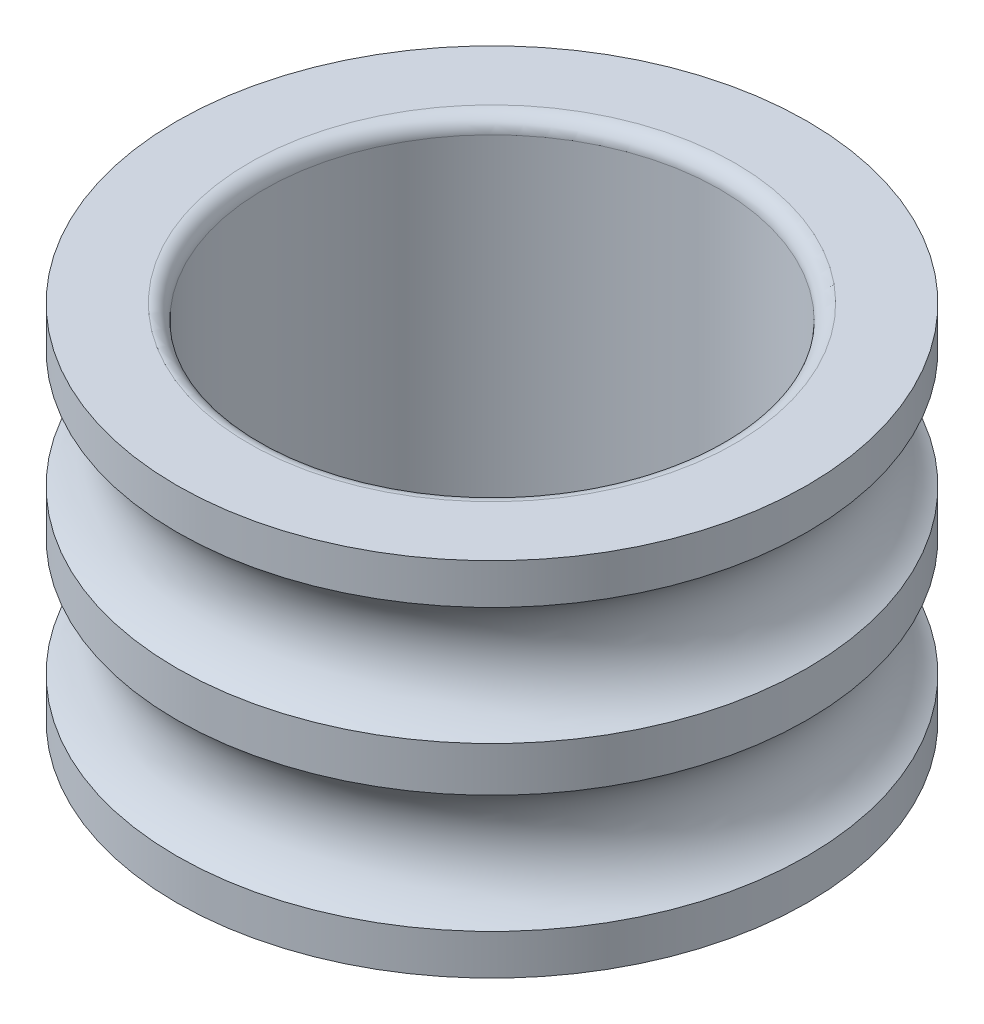
ISO-10303-21;
HEADER;
FILE_DESCRIPTION(('STEP AP214'),'2;1');
FILE_NAME('part.step','',(''),(''),'','','');
FILE_SCHEMA(('AUTOMOTIVE_DESIGN { 1 0 10303 214 1 1 1 1 }'));
ENDSEC;
DATA;
#1=APPLICATION_CONTEXT('core data for automotive mechanical design processes');
#2=APPLICATION_PROTOCOL_DEFINITION('international standard','automotive_design',2000,#1);
#3=PRODUCT_CONTEXT('',#1,'mechanical');
#4=PRODUCT('Part','Part','',(#3));
#5=PRODUCT_RELATED_PRODUCT_CATEGORY('part','',(#4));
#6=PRODUCT_DEFINITION_FORMATION('','',#4);
#7=PRODUCT_DEFINITION_CONTEXT('part definition',#1,'design');
#8=PRODUCT_DEFINITION('design','',#6,#7);
#9=PRODUCT_DEFINITION_SHAPE('','',#8);
#10=(LENGTH_UNIT() NAMED_UNIT(*) SI_UNIT(.MILLI.,.METRE.));
#11=(NAMED_UNIT(*) PLANE_ANGLE_UNIT() SI_UNIT($,.RADIAN.));
#12=(NAMED_UNIT(*) SI_UNIT($,.STERADIAN.) SOLID_ANGLE_UNIT());
#13=UNCERTAINTY_MEASURE_WITH_UNIT(LENGTH_MEASURE(1.E-05),#10,'distance_accuracy_value','');
#14=(GEOMETRIC_REPRESENTATION_CONTEXT(3) GLOBAL_UNCERTAINTY_ASSIGNED_CONTEXT((#13)) GLOBAL_UNIT_ASSIGNED_CONTEXT((#10,
#11,#12)) REPRESENTATION_CONTEXT('',''));
#15=CARTESIAN_POINT('',(0.,0.,0.));
#16=DIRECTION('',(0.,0.,1.));
#17=DIRECTION('',(1.,0.,0.));
#18=AXIS2_PLACEMENT_3D('',#15,#16,#17);
#19=CARTESIAN_POINT('',(0.,-23.8,18.38));
#20=DIRECTION('',(0.,-1.,0.));
#21=DIRECTION('',(-1.,0.,0.));
#22=AXIS2_PLACEMENT_3D('',#19,#20,#21);
#23=PLANE('',#22);
#24=CARTESIAN_POINT('',(0.,-23.8,0.));
#25=DIRECTION('',(0.,1.,0.));
#26=DIRECTION('',(0.,0.,1.));
#27=AXIS2_PLACEMENT_3D('',#24,#25,#26);
#28=CIRCLE('',#27,20.76);
#29=CARTESIAN_POINT('',(0.,-23.8,-20.76));
#30=VERTEX_POINT('',#29);
#31=EDGE_CURVE('E27',#30,#30,#28,.T.);
#32=ORIENTED_EDGE('',*,*,#31,.F.);
#33=EDGE_LOOP('',(#32));
#34=FACE_BOUND('',#33,.T.);
#35=CARTESIAN_POINT('',(0.,-23.8,0.));
#36=DIRECTION('',(0.,1.,0.));
#37=DIRECTION('',(0.,0.,1.));
#38=AXIS2_PLACEMENT_3D('',#35,#36,#37);
#39=CIRCLE('',#38,16.);
#40=CARTESIAN_POINT('',(0.,-23.8,-16.));
#41=VERTEX_POINT('',#40);
#42=EDGE_CURVE('E11',#41,#41,#39,.T.);
#43=ORIENTED_EDGE('',*,*,#42,.T.);
#44=EDGE_LOOP('',(#43));
#45=FACE_BOUND('',#44,.T.);
#46=ADVANCED_FACE('F16',(#34,#45),#23,.T.);
#47=CARTESIAN_POINT('',(0.,-22.4673969044771,0.));
#48=DIRECTION('',(0.,1.,0.));
#49=DIRECTION('',(0.,0.,1.));
#50=AXIS2_PLACEMENT_3D('',#47,#48,#49);
#51=CYLINDRICAL_SURFACE('',#50,20.76);
#52=ORIENTED_EDGE('',*,*,#31,.T.);
#53=EDGE_LOOP('',(#52));
#54=FACE_BOUND('',#53,.T.);
#55=CARTESIAN_POINT('',(0.,-21.1347938089543,0.));
#56=DIRECTION('',(0.,1.,0.));
#57=DIRECTION('',(0.,0.,1.));
#58=AXIS2_PLACEMENT_3D('',#55,#56,#57);
#59=CIRCLE('',#58,20.76);
#60=CARTESIAN_POINT('',(4.61953458893309,-21.1347938089543,20.2395034568947));
#61=VERTEX_POINT('',#60);
#62=EDGE_CURVE('E85',#61,#61,#59,.T.);
#63=ORIENTED_EDGE('',*,*,#62,.F.);
#64=EDGE_LOOP('',(#63));
#65=FACE_BOUND('',#64,.T.);
#66=ADVANCED_FACE('F111',(#54,#65),#51,.T.);
#67=CARTESIAN_POINT('',(0.,-22.8,0.));
#68=DIRECTION('',(0.,1.,0.));
#69=DIRECTION('',(0.,0.,1.));
#70=AXIS2_PLACEMENT_3D('',#67,#68,#69);
#71=TOROIDAL_SURFACE('',#70,16.,1.);
#72=CARTESIAN_POINT('',(0.,-22.8,0.));
#73=DIRECTION('',(0.,1.,0.));
#74=DIRECTION('',(0.,0.,1.));
#75=AXIS2_PLACEMENT_3D('',#72,#73,#74);
#76=CIRCLE('',#75,15.);
#77=CARTESIAN_POINT('',(0.,-22.8,-15.));
#78=VERTEX_POINT('',#77);
#79=EDGE_CURVE('E94',#78,#78,#76,.T.);
#80=ORIENTED_EDGE('',*,*,#79,.T.);
#81=EDGE_LOOP('',(#80));
#82=FACE_BOUND('',#81,.T.);
#83=ORIENTED_EDGE('',*,*,#42,.F.);
#84=EDGE_LOOP('',(#83));
#85=FACE_BOUND('',#84,.T.);
#86=ADVANCED_FACE('F113',(#82,#85),#71,.T.);
#87=CARTESIAN_POINT('',(0.,-17.255,0.));
#88=DIRECTION('',(0.,1.,0.));
#89=DIRECTION('',(0.,0.,1.));
#90=AXIS2_PLACEMENT_3D('',#87,#88,#89);
#91=TOROIDAL_SURFACE('',#90,23.,4.48);
#92=ORIENTED_EDGE('',*,*,#62,.T.);
#93=EDGE_LOOP('',(#92));
#94=FACE_BOUND('',#93,.T.);
#95=CARTESIAN_POINT('',(0.,-13.3752061910457,0.));
#96=DIRECTION('',(0.,1.,0.));
#97=DIRECTION('',(0.,0.,1.));
#98=AXIS2_PLACEMENT_3D('',#95,#96,#97);
#99=CIRCLE('',#98,20.76);
#100=CARTESIAN_POINT('',(4.61953458893309,-13.3752061910457,20.2395034568946));
#101=VERTEX_POINT('',#100);
#102=EDGE_CURVE('E87',#101,#101,#99,.T.);
#103=ORIENTED_EDGE('',*,*,#102,.F.);
#104=EDGE_LOOP('',(#103));
#105=FACE_BOUND('',#104,.T.);
#106=ADVANCED_FACE('F108',(#94,#105),#91,.F.);
#107=CARTESIAN_POINT('',(0.,-11.9,0.));
#108=DIRECTION('',(0.,1.,0.));
#109=DIRECTION('',(0.,0.,1.));
#110=AXIS2_PLACEMENT_3D('',#107,#108,#109);
#111=CYLINDRICAL_SURFACE('',#110,15.);
#112=CARTESIAN_POINT('',(0.,-1.,0.));
#113=DIRECTION('',(0.,1.,0.));
#114=DIRECTION('',(0.,0.,1.));
#115=AXIS2_PLACEMENT_3D('',#112,#113,#114);
#116=CIRCLE('',#115,15.);
#117=CARTESIAN_POINT('',(0.,-1.,-15.));
#118=VERTEX_POINT('',#117);
#119=EDGE_CURVE('E77',#118,#118,#116,.T.);
#120=ORIENTED_EDGE('',*,*,#119,.T.);
#121=EDGE_LOOP('',(#120));
#122=FACE_BOUND('',#121,.T.);
#123=ORIENTED_EDGE('',*,*,#79,.F.);
#124=EDGE_LOOP('',(#123));
#125=FACE_BOUND('',#124,.T.);
#126=ADVANCED_FACE('F130',(#122,#125),#111,.F.);
#127=CARTESIAN_POINT('',(0.,-1.,0.));
#128=DIRECTION('',(0.,1.,0.));
#129=DIRECTION('',(0.,0.,1.));
#130=AXIS2_PLACEMENT_3D('',#127,#128,#129);
#131=TOROIDAL_SURFACE('',#130,16.,1.);
#132=CARTESIAN_POINT('',(0.,0.,0.));
#133=DIRECTION('',(0.,1.,0.));
#134=DIRECTION('',(0.,0.,1.));
#135=AXIS2_PLACEMENT_3D('',#132,#133,#134);
#136=CIRCLE('',#135,16.);
#137=CARTESIAN_POINT('',(0.,0.,-16.));
#138=VERTEX_POINT('',#137);
#139=EDGE_CURVE('E72',#138,#138,#136,.T.);
#140=ORIENTED_EDGE('',*,*,#139,.T.);
#141=EDGE_LOOP('',(#140));
#142=FACE_BOUND('',#141,.T.);
#143=ORIENTED_EDGE('',*,*,#119,.F.);
#144=EDGE_LOOP('',(#143));
#145=FACE_BOUND('',#144,.T.);
#146=ADVANCED_FACE('F133',(#142,#145),#131,.T.);
#147=CARTESIAN_POINT('',(0.,-6.545,0.));
#148=DIRECTION('',(0.,1.,0.));
#149=DIRECTION('',(0.,0.,1.));
#150=AXIS2_PLACEMENT_3D('',#147,#148,#149);
#151=TOROIDAL_SURFACE('',#150,23.,4.48);
#152=CARTESIAN_POINT('',(0.,-2.66520619104571,0.));
#153=DIRECTION('',(0.,1.,0.));
#154=DIRECTION('',(0.,0.,1.));
#155=AXIS2_PLACEMENT_3D('',#152,#153,#154);
#156=CIRCLE('',#155,20.76);
#157=CARTESIAN_POINT('',(16.2308215760363,-2.66520619104572,12.9436482865873));
#158=VERTEX_POINT('',#157);
#159=EDGE_CURVE('E20',#158,#158,#156,.T.);
#160=ORIENTED_EDGE('',*,*,#159,.F.);
#161=EDGE_LOOP('',(#160));
#162=FACE_BOUND('',#161,.T.);
#163=CARTESIAN_POINT('',(0.,-10.4247938089543,0.));
#164=DIRECTION('',(0.,1.,0.));
#165=DIRECTION('',(0.,0.,1.));
#166=AXIS2_PLACEMENT_3D('',#163,#164,#165);
#167=CIRCLE('',#166,20.76);
#168=CARTESIAN_POINT('',(9.00742642408051,-10.4247938089543,18.7041136976542));
#169=VERTEX_POINT('',#168);
#170=EDGE_CURVE('E78',#169,#169,#167,.T.);
#171=ORIENTED_EDGE('',*,*,#170,.T.);
#172=EDGE_LOOP('',(#171));
#173=FACE_BOUND('',#172,.T.);
#174=ADVANCED_FACE('F125',(#162,#173),#151,.F.);
#175=CARTESIAN_POINT('',(0.,-11.9,0.));
#176=DIRECTION('',(0.,1.,0.));
#177=DIRECTION('',(0.,0.,1.));
#178=AXIS2_PLACEMENT_3D('',#175,#176,#177);
#179=CYLINDRICAL_SURFACE('',#178,20.76);
#180=ORIENTED_EDGE('',*,*,#102,.T.);
#181=EDGE_LOOP('',(#180));
#182=FACE_BOUND('',#181,.T.);
#183=ORIENTED_EDGE('',*,*,#170,.F.);
#184=EDGE_LOOP('',(#183));
#185=FACE_BOUND('',#184,.T.);
#186=ADVANCED_FACE('F18',(#182,#185),#179,.T.);
#187=CARTESIAN_POINT('',(0.,0.,18.38));
#188=DIRECTION('',(0.,1.,0.));
#189=DIRECTION('',(1.,0.,0.));
#190=AXIS2_PLACEMENT_3D('',#187,#188,#189);
#191=PLANE('',#190);
#192=ORIENTED_EDGE('',*,*,#139,.F.);
#193=EDGE_LOOP('',(#192));
#194=FACE_BOUND('',#193,.T.);
#195=CARTESIAN_POINT('',(0.,0.,0.));
#196=DIRECTION('',(0.,1.,0.));
#197=DIRECTION('',(0.,0.,1.));
#198=AXIS2_PLACEMENT_3D('',#195,#196,#197);
#199=CIRCLE('',#198,20.76);
#200=CARTESIAN_POINT('',(0.,0.,-20.76));
#201=VERTEX_POINT('',#200);
#202=EDGE_CURVE('E90',#201,#201,#199,.T.);
#203=ORIENTED_EDGE('',*,*,#202,.T.);
#204=EDGE_LOOP('',(#203));
#205=FACE_BOUND('',#204,.T.);
#206=ADVANCED_FACE('F73',(#194,#205),#191,.T.);
#207=CARTESIAN_POINT('',(0.,-1.33260309552286,0.));
#208=DIRECTION('',(0.,1.,0.));
#209=DIRECTION('',(0.,0.,1.));
#210=AXIS2_PLACEMENT_3D('',#207,#208,#209);
#211=CYLINDRICAL_SURFACE('',#210,20.76);
#212=ORIENTED_EDGE('',*,*,#159,.T.);
#213=EDGE_LOOP('',(#212));
#214=FACE_BOUND('',#213,.T.);
#215=ORIENTED_EDGE('',*,*,#202,.F.);
#216=EDGE_LOOP('',(#215));
#217=FACE_BOUND('',#216,.T.);
#218=ADVANCED_FACE('F129',(#214,#217),#211,.T.);
#219=CLOSED_SHELL('',(#46,#66,#86,#106,#126,#146,#174,#186,#206,#218));
#220=MANIFOLD_SOLID_BREP('B1',#219);
#221=ADVANCED_BREP_SHAPE_REPRESENTATION('',(#18,#220),#14);
#222=SHAPE_DEFINITION_REPRESENTATION(#9,#221);
ENDSEC;
END-ISO-10303-21;
